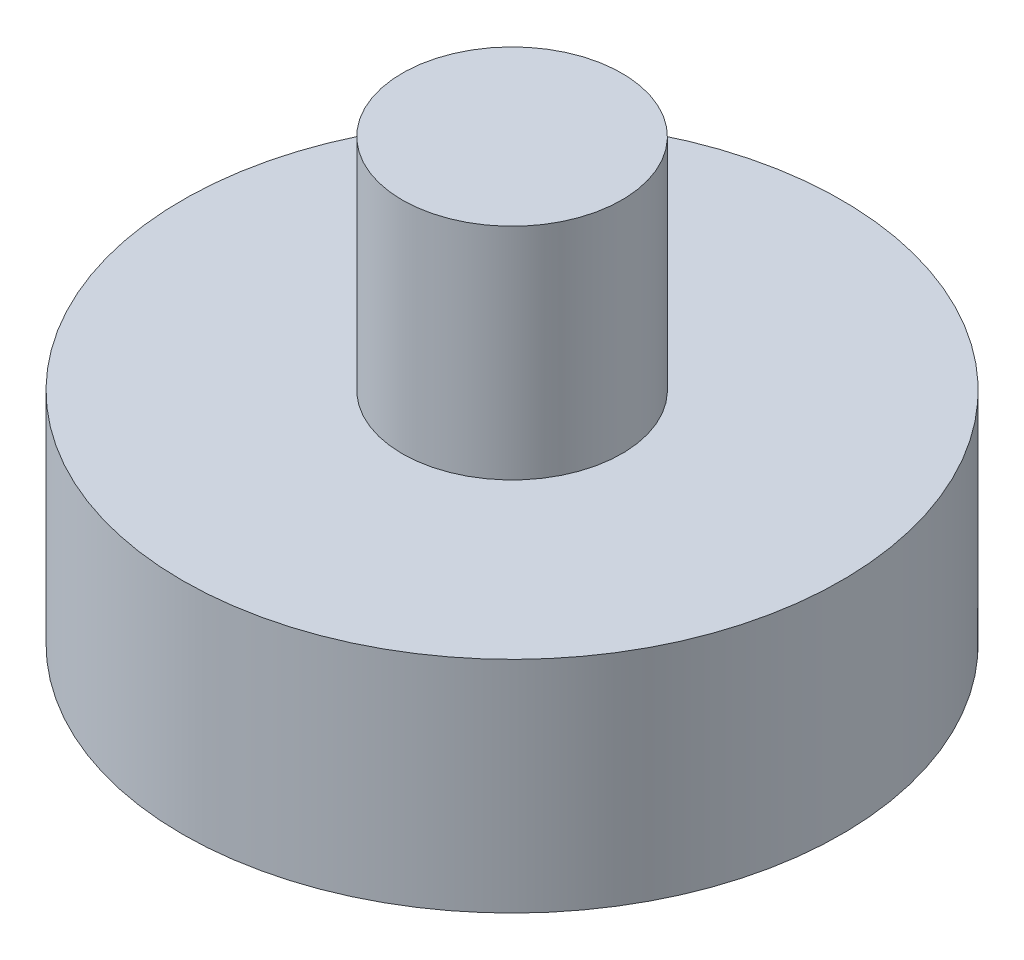
ISO-10303-21;
HEADER;
FILE_DESCRIPTION(('STEP AP214'),'2;1');
FILE_NAME('part.step','',(''),(''),'','','');
FILE_SCHEMA(('AUTOMOTIVE_DESIGN { 1 0 10303 214 1 1 1 1 }'));
ENDSEC;
DATA;
#1=APPLICATION_CONTEXT('core data for automotive mechanical design processes');
#2=APPLICATION_PROTOCOL_DEFINITION('international standard','automotive_design',2000,#1);
#3=PRODUCT_CONTEXT('',#1,'mechanical');
#4=PRODUCT('Part','Part','',(#3));
#5=PRODUCT_RELATED_PRODUCT_CATEGORY('part','',(#4));
#6=PRODUCT_DEFINITION_FORMATION('','',#4);
#7=PRODUCT_DEFINITION_CONTEXT('part definition',#1,'design');
#8=PRODUCT_DEFINITION('design','',#6,#7);
#9=PRODUCT_DEFINITION_SHAPE('','',#8);
#10=(LENGTH_UNIT() NAMED_UNIT(*) SI_UNIT(.MILLI.,.METRE.));
#11=(NAMED_UNIT(*) PLANE_ANGLE_UNIT() SI_UNIT($,.RADIAN.));
#12=(NAMED_UNIT(*) SI_UNIT($,.STERADIAN.) SOLID_ANGLE_UNIT());
#13=UNCERTAINTY_MEASURE_WITH_UNIT(LENGTH_MEASURE(1.E-05),#10,'distance_accuracy_value','');
#14=(GEOMETRIC_REPRESENTATION_CONTEXT(3) GLOBAL_UNCERTAINTY_ASSIGNED_CONTEXT((#13)) GLOBAL_UNIT_ASSIGNED_CONTEXT((#10,
#11,#12)) REPRESENTATION_CONTEXT('',''));
#15=CARTESIAN_POINT('',(0.,0.,0.));
#16=DIRECTION('',(0.,0.,1.));
#17=DIRECTION('',(1.,0.,0.));
#18=AXIS2_PLACEMENT_3D('',#15,#16,#17);
#19=CARTESIAN_POINT('',(0.,5.,0.));
#20=DIRECTION('',(0.,-1.,0.));
#21=DIRECTION('',(0.,0.,-1.));
#22=AXIS2_PLACEMENT_3D('',#19,#20,#21);
#23=CYLINDRICAL_SURFACE('',#22,7.5);
#24=CARTESIAN_POINT('',(0.,5.,0.));
#25=DIRECTION('',(0.,1.,0.));
#26=DIRECTION('',(0.,0.,1.));
#27=AXIS2_PLACEMENT_3D('',#24,#25,#26);
#28=CIRCLE('',#27,7.5);
#29=CARTESIAN_POINT('',(0.,5.,7.5));
#30=VERTEX_POINT('',#29);
#31=EDGE_CURVE('E10',#30,#30,#28,.T.);
#32=ORIENTED_EDGE('',*,*,#31,.F.);
#33=EDGE_LOOP('',(#32));
#34=FACE_BOUND('',#33,.T.);
#35=CARTESIAN_POINT('',(0.,0.,0.));
#36=DIRECTION('',(0.,1.,0.));
#37=DIRECTION('',(0.,0.,1.));
#38=AXIS2_PLACEMENT_3D('',#35,#36,#37);
#39=CIRCLE('',#38,7.5);
#40=CARTESIAN_POINT('',(0.,0.,7.5));
#41=VERTEX_POINT('',#40);
#42=EDGE_CURVE('E36',#41,#41,#39,.T.);
#43=ORIENTED_EDGE('',*,*,#42,.T.);
#44=EDGE_LOOP('',(#43));
#45=FACE_BOUND('',#44,.T.);
#46=ADVANCED_FACE('F33',(#34,#45),#23,.T.);
#47=CARTESIAN_POINT('',(0.,0.,0.));
#48=DIRECTION('',(0.,1.,0.));
#49=DIRECTION('',(0.,0.,1.));
#50=AXIS2_PLACEMENT_3D('',#47,#48,#49);
#51=PLANE('',#50);
#52=ORIENTED_EDGE('',*,*,#42,.F.);
#53=EDGE_LOOP('',(#52));
#54=FACE_BOUND('',#53,.T.);
#55=ADVANCED_FACE('F75',(#54),#51,.F.);
#56=CARTESIAN_POINT('',(0.,15.,0.));
#57=DIRECTION('',(0.,-1.,0.));
#58=DIRECTION('',(0.,0.,-1.));
#59=AXIS2_PLACEMENT_3D('',#56,#57,#58);
#60=CYLINDRICAL_SURFACE('',#59,15.);
#61=CARTESIAN_POINT('',(0.,15.,0.));
#62=DIRECTION('',(0.,1.,0.));
#63=DIRECTION('',(0.,0.,1.));
#64=AXIS2_PLACEMENT_3D('',#61,#62,#63);
#65=CIRCLE('',#64,15.);
#66=CARTESIAN_POINT('',(0.,15.,15.));
#67=VERTEX_POINT('',#66);
#68=EDGE_CURVE('E43',#67,#67,#65,.T.);
#69=ORIENTED_EDGE('',*,*,#68,.F.);
#70=EDGE_LOOP('',(#69));
#71=FACE_BOUND('',#70,.T.);
#72=CARTESIAN_POINT('',(0.,5.,0.));
#73=DIRECTION('',(0.,1.,0.));
#74=DIRECTION('',(0.,0.,1.));
#75=AXIS2_PLACEMENT_3D('',#72,#73,#74);
#76=CIRCLE('',#75,15.);
#77=CARTESIAN_POINT('',(0.,5.,15.));
#78=VERTEX_POINT('',#77);
#79=EDGE_CURVE('E45',#78,#78,#76,.T.);
#80=ORIENTED_EDGE('',*,*,#79,.T.);
#81=EDGE_LOOP('',(#80));
#82=FACE_BOUND('',#81,.T.);
#83=ADVANCED_FACE('F69',(#71,#82),#60,.T.);
#84=CARTESIAN_POINT('',(0.,15.,0.));
#85=DIRECTION('',(0.,1.,0.));
#86=DIRECTION('',(0.,0.,1.));
#87=AXIS2_PLACEMENT_3D('',#84,#85,#86);
#88=PLANE('',#87);
#89=CARTESIAN_POINT('',(0.,15.,0.));
#90=DIRECTION('',(0.,1.,0.));
#91=DIRECTION('',(0.,0.,1.));
#92=AXIS2_PLACEMENT_3D('',#89,#90,#91);
#93=CIRCLE('',#92,5.);
#94=CARTESIAN_POINT('',(0.,15.,5.));
#95=VERTEX_POINT('',#94);
#96=EDGE_CURVE('E51',#95,#95,#93,.T.);
#97=ORIENTED_EDGE('',*,*,#96,.F.);
#98=EDGE_LOOP('',(#97));
#99=FACE_BOUND('',#98,.T.);
#100=ORIENTED_EDGE('',*,*,#68,.T.);
#101=EDGE_LOOP('',(#100));
#102=FACE_BOUND('',#101,.T.);
#103=ADVANCED_FACE('F66',(#99,#102),#88,.T.);
#104=CARTESIAN_POINT('',(0.,5.,0.));
#105=DIRECTION('',(0.,1.,0.));
#106=DIRECTION('',(0.,0.,1.));
#107=AXIS2_PLACEMENT_3D('',#104,#105,#106);
#108=PLANE('',#107);
#109=ORIENTED_EDGE('',*,*,#31,.T.);
#110=EDGE_LOOP('',(#109));
#111=FACE_BOUND('',#110,.T.);
#112=ORIENTED_EDGE('',*,*,#79,.F.);
#113=EDGE_LOOP('',(#112));
#114=FACE_BOUND('',#113,.T.);
#115=ADVANCED_FACE('F62',(#111,#114),#108,.F.);
#116=CARTESIAN_POINT('',(0.,25.,0.));
#117=DIRECTION('',(0.,-1.,0.));
#118=DIRECTION('',(0.,0.,-1.));
#119=AXIS2_PLACEMENT_3D('',#116,#117,#118);
#120=CYLINDRICAL_SURFACE('',#119,5.);
#121=CARTESIAN_POINT('',(0.,25.,0.));
#122=DIRECTION('',(0.,1.,0.));
#123=DIRECTION('',(0.,0.,1.));
#124=AXIS2_PLACEMENT_3D('',#121,#122,#123);
#125=CIRCLE('',#124,5.);
#126=CARTESIAN_POINT('',(0.,25.,5.));
#127=VERTEX_POINT('',#126);
#128=EDGE_CURVE('E48',#127,#127,#125,.T.);
#129=ORIENTED_EDGE('',*,*,#128,.F.);
#130=EDGE_LOOP('',(#129));
#131=FACE_BOUND('',#130,.T.);
#132=ORIENTED_EDGE('',*,*,#96,.T.);
#133=EDGE_LOOP('',(#132));
#134=FACE_BOUND('',#133,.T.);
#135=ADVANCED_FACE('F59',(#131,#134),#120,.T.);
#136=CARTESIAN_POINT('',(0.,25.,0.));
#137=DIRECTION('',(0.,1.,0.));
#138=DIRECTION('',(0.,0.,1.));
#139=AXIS2_PLACEMENT_3D('',#136,#137,#138);
#140=PLANE('',#139);
#141=ORIENTED_EDGE('',*,*,#128,.T.);
#142=EDGE_LOOP('',(#141));
#143=FACE_BOUND('',#142,.T.);
#144=ADVANCED_FACE('F57',(#143),#140,.T.);
#145=CLOSED_SHELL('',(#46,#55,#83,#103,#115,#135,#144));
#146=MANIFOLD_SOLID_BREP('B2',#145);
#147=ADVANCED_BREP_SHAPE_REPRESENTATION('',(#18,#146),#14);
#148=SHAPE_DEFINITION_REPRESENTATION(#9,#147);
ENDSEC;
END-ISO-10303-21;
